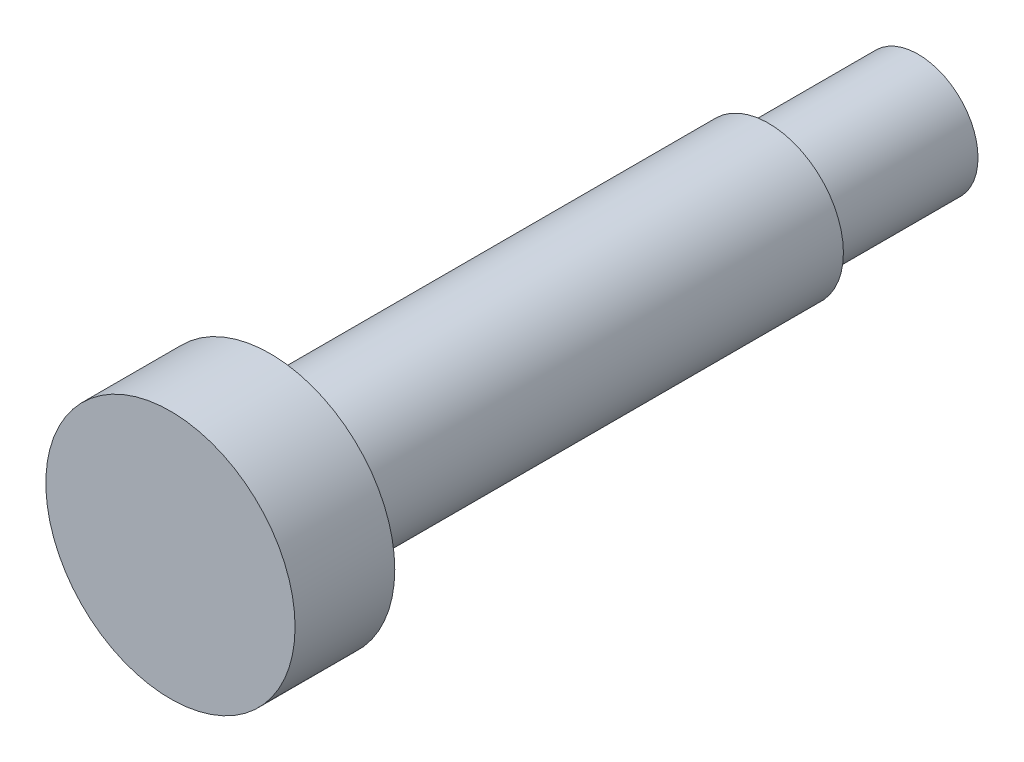
ISO-10303-21;
HEADER;
FILE_DESCRIPTION(('STEP AP214'),'2;1');
FILE_NAME('part.step','',(''),(''),'','','');
FILE_SCHEMA(('AUTOMOTIVE_DESIGN { 1 0 10303 214 1 1 1 1 }'));
ENDSEC;
DATA;
#1=APPLICATION_CONTEXT('core data for automotive mechanical design processes');
#2=APPLICATION_PROTOCOL_DEFINITION('international standard','automotive_design',2000,#1);
#3=PRODUCT_CONTEXT('',#1,'mechanical');
#4=PRODUCT('Part','Part','',(#3));
#5=PRODUCT_RELATED_PRODUCT_CATEGORY('part','',(#4));
#6=PRODUCT_DEFINITION_FORMATION('','',#4);
#7=PRODUCT_DEFINITION_CONTEXT('part definition',#1,'design');
#8=PRODUCT_DEFINITION('design','',#6,#7);
#9=PRODUCT_DEFINITION_SHAPE('','',#8);
#10=(LENGTH_UNIT() NAMED_UNIT(*) SI_UNIT(.MILLI.,.METRE.));
#11=(NAMED_UNIT(*) PLANE_ANGLE_UNIT() SI_UNIT($,.RADIAN.));
#12=(NAMED_UNIT(*) SI_UNIT($,.STERADIAN.) SOLID_ANGLE_UNIT());
#13=UNCERTAINTY_MEASURE_WITH_UNIT(LENGTH_MEASURE(1.E-05),#10,'distance_accuracy_value','');
#14=(GEOMETRIC_REPRESENTATION_CONTEXT(3) GLOBAL_UNCERTAINTY_ASSIGNED_CONTEXT((#13)) GLOBAL_UNIT_ASSIGNED_CONTEXT((#10,
#11,#12)) REPRESENTATION_CONTEXT('',''));
#15=CARTESIAN_POINT('',(0.,0.,0.));
#16=DIRECTION('',(0.,0.,1.));
#17=DIRECTION('',(1.,0.,0.));
#18=AXIS2_PLACEMENT_3D('',#15,#16,#17);
#19=CARTESIAN_POINT('',(0.,0.,-3.));
#20=DIRECTION('',(0.,0.,1.));
#21=DIRECTION('',(1.,0.,0.));
#22=AXIS2_PLACEMENT_3D('',#19,#20,#21);
#23=PLANE('',#22);
#24=CARTESIAN_POINT('',(0.,0.,-3.));
#25=DIRECTION('',(0.,0.,1.));
#26=DIRECTION('',(1.,0.,0.));
#27=AXIS2_PLACEMENT_3D('',#24,#25,#26);
#28=CIRCLE('',#27,1.2);
#29=CARTESIAN_POINT('',(1.2,0.,-3.));
#30=VERTEX_POINT('',#29);
#31=EDGE_CURVE('E9',#30,#30,#28,.T.);
#32=ORIENTED_EDGE('',*,*,#31,.F.);
#33=EDGE_LOOP('',(#32));
#34=FACE_BOUND('',#33,.T.);
#35=ADVANCED_FACE('F14',(#34),#23,.F.);
#36=CARTESIAN_POINT('',(0.,0.,-3.));
#37=DIRECTION('',(0.,0.,1.));
#38=DIRECTION('',(1.,0.,0.));
#39=AXIS2_PLACEMENT_3D('',#36,#37,#38);
#40=CYLINDRICAL_SURFACE('',#39,1.2);
#41=CARTESIAN_POINT('',(0.,0.,0.));
#42=DIRECTION('',(0.,0.,1.));
#43=DIRECTION('',(1.,0.,0.));
#44=AXIS2_PLACEMENT_3D('',#41,#42,#43);
#45=CIRCLE('',#44,1.2);
#46=CARTESIAN_POINT('',(1.2,0.,0.));
#47=VERTEX_POINT('',#46);
#48=EDGE_CURVE('E22',#47,#47,#45,.T.);
#49=ORIENTED_EDGE('',*,*,#48,.F.);
#50=EDGE_LOOP('',(#49));
#51=FACE_BOUND('',#50,.T.);
#52=ORIENTED_EDGE('',*,*,#31,.T.);
#53=EDGE_LOOP('',(#52));
#54=FACE_BOUND('',#53,.T.);
#55=ADVANCED_FACE('F74',(#51,#54),#40,.T.);
#56=CARTESIAN_POINT('',(0.,0.,0.));
#57=DIRECTION('',(0.,0.,1.));
#58=DIRECTION('',(1.,0.,0.));
#59=AXIS2_PLACEMENT_3D('',#56,#57,#58);
#60=PLANE('',#59);
#61=ORIENTED_EDGE('',*,*,#48,.T.);
#62=EDGE_LOOP('',(#61));
#63=FACE_BOUND('',#62,.T.);
#64=CARTESIAN_POINT('',(0.,0.,0.));
#65=DIRECTION('',(0.,0.,1.));
#66=DIRECTION('',(1.,0.,0.));
#67=AXIS2_PLACEMENT_3D('',#64,#65,#66);
#68=CIRCLE('',#67,1.5);
#69=CARTESIAN_POINT('',(1.5,0.,0.));
#70=VERTEX_POINT('',#69);
#71=EDGE_CURVE('E31',#70,#70,#68,.T.);
#72=ORIENTED_EDGE('',*,*,#71,.F.);
#73=EDGE_LOOP('',(#72));
#74=FACE_BOUND('',#73,.T.);
#75=ADVANCED_FACE('F16',(#63,#74),#60,.F.);
#76=CARTESIAN_POINT('',(0.,0.,0.));
#77=DIRECTION('',(0.,0.,1.));
#78=DIRECTION('',(1.,0.,0.));
#79=AXIS2_PLACEMENT_3D('',#76,#77,#78);
#80=CYLINDRICAL_SURFACE('',#79,1.5);
#81=CARTESIAN_POINT('',(0.,0.,10.));
#82=DIRECTION('',(0.,0.,1.));
#83=DIRECTION('',(1.,0.,0.));
#84=AXIS2_PLACEMENT_3D('',#81,#82,#83);
#85=CIRCLE('',#84,1.5);
#86=CARTESIAN_POINT('',(1.5,0.,10.));
#87=VERTEX_POINT('',#86);
#88=EDGE_CURVE('E38',#87,#87,#85,.T.);
#89=ORIENTED_EDGE('',*,*,#88,.F.);
#90=EDGE_LOOP('',(#89));
#91=FACE_BOUND('',#90,.T.);
#92=ORIENTED_EDGE('',*,*,#71,.T.);
#93=EDGE_LOOP('',(#92));
#94=FACE_BOUND('',#93,.T.);
#95=ADVANCED_FACE('F62',(#91,#94),#80,.T.);
#96=CARTESIAN_POINT('',(0.,0.,10.));
#97=DIRECTION('',(0.,0.,1.));
#98=DIRECTION('',(1.,0.,0.));
#99=AXIS2_PLACEMENT_3D('',#96,#97,#98);
#100=PLANE('',#99);
#101=ORIENTED_EDGE('',*,*,#88,.T.);
#102=EDGE_LOOP('',(#101));
#103=FACE_BOUND('',#102,.T.);
#104=CARTESIAN_POINT('',(0.,0.,10.));
#105=DIRECTION('',(0.,0.,1.));
#106=DIRECTION('',(1.,0.,0.));
#107=AXIS2_PLACEMENT_3D('',#104,#105,#106);
#108=CIRCLE('',#107,2.5);
#109=CARTESIAN_POINT('',(2.5,0.,10.));
#110=VERTEX_POINT('',#109);
#111=EDGE_CURVE('E42',#110,#110,#108,.T.);
#112=ORIENTED_EDGE('',*,*,#111,.F.);
#113=EDGE_LOOP('',(#112));
#114=FACE_BOUND('',#113,.T.);
#115=ADVANCED_FACE('F60',(#103,#114),#100,.F.);
#116=CARTESIAN_POINT('',(0.,0.,12.));
#117=DIRECTION('',(0.,0.,1.));
#118=DIRECTION('',(1.,0.,0.));
#119=AXIS2_PLACEMENT_3D('',#116,#117,#118);
#120=PLANE('',#119);
#121=CARTESIAN_POINT('',(0.,0.,12.));
#122=DIRECTION('',(0.,0.,1.));
#123=DIRECTION('',(1.,0.,0.));
#124=AXIS2_PLACEMENT_3D('',#121,#122,#123);
#125=CIRCLE('',#124,2.5);
#126=CARTESIAN_POINT('',(2.5,0.,12.));
#127=VERTEX_POINT('',#126);
#128=EDGE_CURVE('E46',#127,#127,#125,.T.);
#129=ORIENTED_EDGE('',*,*,#128,.T.);
#130=EDGE_LOOP('',(#129));
#131=FACE_BOUND('',#130,.T.);
#132=ADVANCED_FACE('F52',(#131),#120,.T.);
#133=CARTESIAN_POINT('',(0.,0.,10.));
#134=DIRECTION('',(0.,0.,1.));
#135=DIRECTION('',(1.,0.,0.));
#136=AXIS2_PLACEMENT_3D('',#133,#134,#135);
#137=CYLINDRICAL_SURFACE('',#136,2.5);
#138=ORIENTED_EDGE('',*,*,#128,.F.);
#139=EDGE_LOOP('',(#138));
#140=FACE_BOUND('',#139,.T.);
#141=ORIENTED_EDGE('',*,*,#111,.T.);
#142=EDGE_LOOP('',(#141));
#143=FACE_BOUND('',#142,.T.);
#144=ADVANCED_FACE('F54',(#140,#143),#137,.T.);
#145=CLOSED_SHELL('',(#35,#55,#75,#95,#115,#132,#144));
#146=MANIFOLD_SOLID_BREP('B1',#145);
#147=ADVANCED_BREP_SHAPE_REPRESENTATION('',(#18,#146),#14);
#148=SHAPE_DEFINITION_REPRESENTATION(#9,#147);
ENDSEC;
END-ISO-10303-21;
